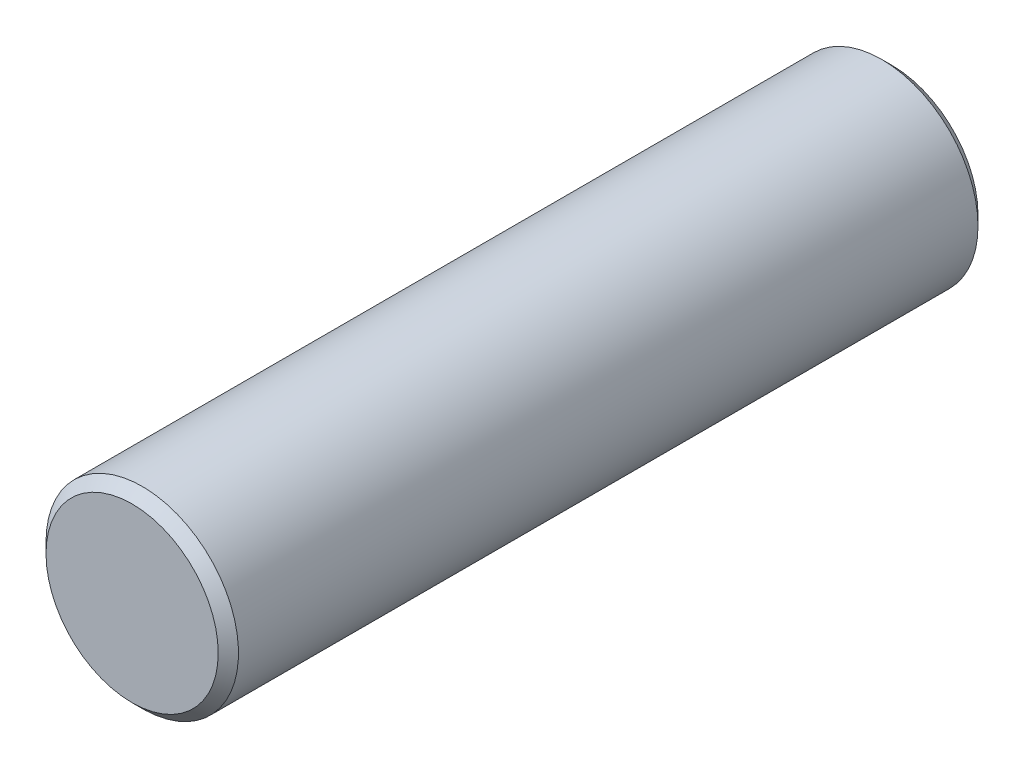
ISO-10303-21;
HEADER;
FILE_DESCRIPTION(('STEP AP214'),'2;1');
FILE_NAME('part.step','',(''),(''),'','','');
FILE_SCHEMA(('AUTOMOTIVE_DESIGN { 1 0 10303 214 1 1 1 1 }'));
ENDSEC;
DATA;
#1=APPLICATION_CONTEXT('core data for automotive mechanical design processes');
#2=APPLICATION_PROTOCOL_DEFINITION('international standard','automotive_design',2000,#1);
#3=PRODUCT_CONTEXT('',#1,'mechanical');
#4=PRODUCT('Part','Part','',(#3));
#5=PRODUCT_RELATED_PRODUCT_CATEGORY('part','',(#4));
#6=PRODUCT_DEFINITION_FORMATION('','',#4);
#7=PRODUCT_DEFINITION_CONTEXT('part definition',#1,'design');
#8=PRODUCT_DEFINITION('design','',#6,#7);
#9=PRODUCT_DEFINITION_SHAPE('','',#8);
#10=(LENGTH_UNIT() NAMED_UNIT(*) SI_UNIT(.MILLI.,.METRE.));
#11=(NAMED_UNIT(*) PLANE_ANGLE_UNIT() SI_UNIT($,.RADIAN.));
#12=(NAMED_UNIT(*) SI_UNIT($,.STERADIAN.) SOLID_ANGLE_UNIT());
#13=UNCERTAINTY_MEASURE_WITH_UNIT(LENGTH_MEASURE(1.E-05),#10,'distance_accuracy_value','');
#14=(GEOMETRIC_REPRESENTATION_CONTEXT(3) GLOBAL_UNCERTAINTY_ASSIGNED_CONTEXT((#13)) GLOBAL_UNIT_ASSIGNED_CONTEXT((#10,
#11,#12)) REPRESENTATION_CONTEXT('',''));
#15=CARTESIAN_POINT('',(0.,0.,0.));
#16=DIRECTION('',(0.,0.,1.));
#17=DIRECTION('',(1.,0.,0.));
#18=AXIS2_PLACEMENT_3D('',#15,#16,#17);
#19=CARTESIAN_POINT('',(0.,0.,38.1));
#20=DIRECTION('',(0.,0.,-1.));
#21=DIRECTION('',(-1.,0.,0.));
#22=AXIS2_PLACEMENT_3D('',#19,#20,#21);
#23=CYLINDRICAL_SURFACE('',#22,4.826);
#24=CARTESIAN_POINT('',(0.,0.,0.508000000000036));
#25=DIRECTION('',(0.,0.,1.));
#26=DIRECTION('',(1.,0.,0.));
#27=AXIS2_PLACEMENT_3D('',#24,#25,#26);
#28=CIRCLE('',#27,4.826);
#29=CARTESIAN_POINT('',(-4.826,0.,0.508000000000036));
#30=VERTEX_POINT('',#29);
#31=EDGE_CURVE('E53',#30,#30,#28,.T.);
#32=CARTESIAN_POINT('',(0.,0.,37.592));
#33=DIRECTION('',(0.,0.,1.));
#34=DIRECTION('',(1.,0.,0.));
#35=AXIS2_PLACEMENT_3D('',#32,#33,#34);
#36=CIRCLE('',#35,4.826);
#37=CARTESIAN_POINT('',(-4.826,0.,37.592));
#38=VERTEX_POINT('',#37);
#39=EDGE_CURVE('E58',#38,#38,#36,.F.);
#40=CARTESIAN_POINT('',(-4.826,0.,0.508000000000036));
#41=CARTESIAN_POINT('',(-4.826,0.,0.894291666666702));
#42=CARTESIAN_POINT('',(-4.826,0.,1.28058333333337));
#43=CARTESIAN_POINT('',(-4.826,0.,2.0531666666667));
#44=CARTESIAN_POINT('',(-4.826,0.,2.43945833333337));
#45=CARTESIAN_POINT('',(-4.826,0.,3.2120416666667));
#46=CARTESIAN_POINT('',(-4.826,0.,3.59833333333337));
#47=CARTESIAN_POINT('',(-4.826,0.,4.3709166666667));
#48=CARTESIAN_POINT('',(-4.826,0.,4.75720833333337));
#49=CARTESIAN_POINT('',(-4.826,0.,5.5297916666667));
#50=CARTESIAN_POINT('',(-4.826,0.,5.91608333333337));
#51=CARTESIAN_POINT('',(-4.826,0.,6.6886666666667));
#52=CARTESIAN_POINT('',(-4.826,0.,7.07495833333336));
#53=CARTESIAN_POINT('',(-4.826,0.,7.8475416666667));
#54=CARTESIAN_POINT('',(-4.826,0.,8.23383333333336));
#55=CARTESIAN_POINT('',(-4.826,0.,9.0064166666667));
#56=CARTESIAN_POINT('',(-4.826,0.,9.39270833333336));
#57=CARTESIAN_POINT('',(-4.826,0.,10.1652916666667));
#58=CARTESIAN_POINT('',(-4.826,0.,10.5515833333334));
#59=CARTESIAN_POINT('',(-4.826,0.,11.3241666666667));
#60=CARTESIAN_POINT('',(-4.826,0.,11.7104583333334));
#61=CARTESIAN_POINT('',(-4.826,0.,12.4830416666667));
#62=CARTESIAN_POINT('',(-4.826,0.,12.8693333333334));
#63=CARTESIAN_POINT('',(-4.826,0.,13.6419166666667));
#64=CARTESIAN_POINT('',(-4.826,0.,14.0282083333334));
#65=CARTESIAN_POINT('',(-4.826,0.,14.8007916666667));
#66=CARTESIAN_POINT('',(-4.826,0.,15.1870833333334));
#67=CARTESIAN_POINT('',(-4.826,0.,15.9596666666667));
#68=CARTESIAN_POINT('',(-4.826,0.,16.3459583333334));
#69=CARTESIAN_POINT('',(-4.826,0.,17.1185416666667));
#70=CARTESIAN_POINT('',(-4.826,0.,17.5048333333334));
#71=CARTESIAN_POINT('',(-4.826,0.,18.2774166666667));
#72=CARTESIAN_POINT('',(-4.826,0.,18.6637083333334));
#73=CARTESIAN_POINT('',(-4.826,0.,19.4362916666667));
#74=CARTESIAN_POINT('',(-4.826,0.,19.8225833333334));
#75=CARTESIAN_POINT('',(-4.826,0.,20.5951666666667));
#76=CARTESIAN_POINT('',(-4.826,0.,20.9814583333334));
#77=CARTESIAN_POINT('',(-4.826,0.,21.7540416666667));
#78=CARTESIAN_POINT('',(-4.826,0.,22.1403333333334));
#79=CARTESIAN_POINT('',(-4.826,0.,22.9129166666667));
#80=CARTESIAN_POINT('',(-4.826,0.,23.2992083333334));
#81=CARTESIAN_POINT('',(-4.826,0.,24.0717916666667));
#82=CARTESIAN_POINT('',(-4.826,0.,24.4580833333334));
#83=CARTESIAN_POINT('',(-4.826,0.,25.2306666666667));
#84=CARTESIAN_POINT('',(-4.826,0.,25.6169583333334));
#85=CARTESIAN_POINT('',(-4.826,0.,26.3895416666667));
#86=CARTESIAN_POINT('',(-4.826,0.,26.7758333333334));
#87=CARTESIAN_POINT('',(-4.826,0.,27.5484166666667));
#88=CARTESIAN_POINT('',(-4.826,0.,27.9347083333334));
#89=CARTESIAN_POINT('',(-4.826,0.,28.7072916666667));
#90=CARTESIAN_POINT('',(-4.826,0.,29.0935833333334));
#91=CARTESIAN_POINT('',(-4.826,0.,29.8661666666667));
#92=CARTESIAN_POINT('',(-4.826,0.,30.2524583333334));
#93=CARTESIAN_POINT('',(-4.826,0.,31.0250416666667));
#94=CARTESIAN_POINT('',(-4.826,0.,31.4113333333334));
#95=CARTESIAN_POINT('',(-4.826,0.,32.1839166666667));
#96=CARTESIAN_POINT('',(-4.826,0.,32.5702083333334));
#97=CARTESIAN_POINT('',(-4.826,0.,33.3427916666667));
#98=CARTESIAN_POINT('',(-4.826,0.,33.7290833333334));
#99=CARTESIAN_POINT('',(-4.826,0.,34.5016666666667));
#100=CARTESIAN_POINT('',(-4.826,0.,34.8879583333334));
#101=CARTESIAN_POINT('',(-4.826,0.,35.6605416666667));
#102=CARTESIAN_POINT('',(-4.826,0.,36.0468333333334));
#103=CARTESIAN_POINT('',(-4.826,0.,36.8194166666667));
#104=CARTESIAN_POINT('',(-4.826,0.,37.2057083333334));
#105=CARTESIAN_POINT('',(-4.826,0.,37.592));
#106=B_SPLINE_CURVE_WITH_KNOTS('',3,(#40,#41,#42,#43,#44,#45,#46,#47,#48,#49,#50,#51,#52,#53,
#54,#55,#56,#57,#58,#59,#60,#61,#62,#63,#64,#65,#66,#67,#68,#69,#70,#71,#72,#73,#74,#75,#76,#77,
#78,#79,#80,#81,#82,#83,#84,#85,#86,#87,#88,#89,#90,#91,#92,#93,#94,#95,#96,#97,#98,#99,#100,
#101,#102,#103,#104,#105),.UNSPECIFIED.,.F.,.F.,(4,2,2,2,2,2,2,2,2,2,2,2,2,2,2,2,2,2,2,2,2,2,2,
2,2,2,2,2,2,2,2,2,4),(0.,1.158875,2.31775,3.476625,4.6355,5.794375,6.95324999999999,
8.11212499999999,9.27099999999999,10.429875,11.58875,12.747625,13.9065,15.065375,16.22425,
17.383125,18.542,19.700875,20.85975,22.018625,23.1775,24.336375,25.49525,26.654125,27.813,
28.971875,30.13075,31.289625,32.4485,33.607375,34.76625,35.925125,37.084),.UNSPECIFIED.);
#107=EDGE_CURVE('BSEAM39',#30,#38,#106,.T.);
#108=ORIENTED_EDGE('',*,*,#31,.T.);
#109=ORIENTED_EDGE('',*,*,#39,.T.);
#110=ORIENTED_EDGE('',*,*,#107,.T.);
#111=ORIENTED_EDGE('',*,*,#107,.F.);
#112=EDGE_LOOP('',(#108,#110,#109,#111));
#113=FACE_BOUND('',#112,.T.);
#114=ADVANCED_FACE('F39',(#113),#23,.T.);
#115=CARTESIAN_POINT('',(0.,0.,38.1));
#116=DIRECTION('',(0.,0.,1.));
#117=DIRECTION('',(1.,0.,0.));
#118=AXIS2_PLACEMENT_3D('',#115,#116,#117);
#119=PLANE('',#118);
#120=CARTESIAN_POINT('',(0.,0.,38.1));
#121=DIRECTION('',(0.,0.,1.));
#122=DIRECTION('',(1.,0.,0.));
#123=AXIS2_PLACEMENT_3D('',#120,#121,#122);
#124=CIRCLE('',#123,4.31800000000002);
#125=CARTESIAN_POINT('',(4.31800000000002,0.,38.1));
#126=VERTEX_POINT('',#125);
#127=EDGE_CURVE('E10',#126,#126,#124,.T.);
#128=ORIENTED_EDGE('',*,*,#127,.T.);
#129=EDGE_LOOP('',(#128));
#130=FACE_BOUND('',#129,.T.);
#131=ADVANCED_FACE('F75',(#130),#119,.T.);
#132=CARTESIAN_POINT('',(0.,0.,0.));
#133=DIRECTION('',(0.,0.,1.));
#134=DIRECTION('',(1.,0.,0.));
#135=AXIS2_PLACEMENT_3D('',#132,#133,#134);
#136=PLANE('',#135);
#137=CARTESIAN_POINT('',(0.,0.,0.));
#138=DIRECTION('',(0.,0.,1.));
#139=DIRECTION('',(1.,0.,0.));
#140=AXIS2_PLACEMENT_3D('',#137,#138,#139);
#141=CIRCLE('',#140,4.31799999999996);
#142=CARTESIAN_POINT('',(4.31799999999996,0.,0.));
#143=VERTEX_POINT('',#142);
#144=EDGE_CURVE('E48',#143,#143,#141,.F.);
#145=ORIENTED_EDGE('',*,*,#144,.T.);
#146=EDGE_LOOP('',(#145));
#147=FACE_BOUND('',#146,.T.);
#148=ADVANCED_FACE('F72',(#147),#136,.F.);
#149=CARTESIAN_POINT('',(0.,0.,0.508000000000036));
#150=DIRECTION('',(0.,0.,1.));
#151=DIRECTION('',(1.,0.,0.));
#152=AXIS2_PLACEMENT_3D('',#149,#150,#151);
#153=CONICAL_SURFACE('',#152,4.826,0.785398163397454);
#154=ORIENTED_EDGE('',*,*,#144,.F.);
#155=EDGE_LOOP('',(#154));
#156=FACE_BOUND('',#155,.T.);
#157=ORIENTED_EDGE('',*,*,#31,.F.);
#158=EDGE_LOOP('',(#157));
#159=FACE_BOUND('',#158,.T.);
#160=ADVANCED_FACE('F68',(#156,#159),#153,.T.);
#161=CARTESIAN_POINT('',(0.,0.,38.1));
#162=DIRECTION('',(0.,0.,-1.));
#163=DIRECTION('',(-1.,0.,0.));
#164=AXIS2_PLACEMENT_3D('',#161,#162,#163);
#165=CONICAL_SURFACE('',#164,4.31800000000002,0.785398163397454);
#166=ORIENTED_EDGE('',*,*,#39,.F.);
#167=EDGE_LOOP('',(#166));
#168=FACE_BOUND('',#167,.T.);
#169=ORIENTED_EDGE('',*,*,#127,.F.);
#170=EDGE_LOOP('',(#169));
#171=FACE_BOUND('',#170,.T.);
#172=ADVANCED_FACE('F42',(#168,#171),#165,.T.);
#173=CLOSED_SHELL('',(#114,#131,#148,#160,#172));
#174=MANIFOLD_SOLID_BREP('B2',#173);
#175=ADVANCED_BREP_SHAPE_REPRESENTATION('',(#18,#174),#14);
#176=SHAPE_DEFINITION_REPRESENTATION(#9,#175);
ENDSEC;
END-ISO-10303-21;
